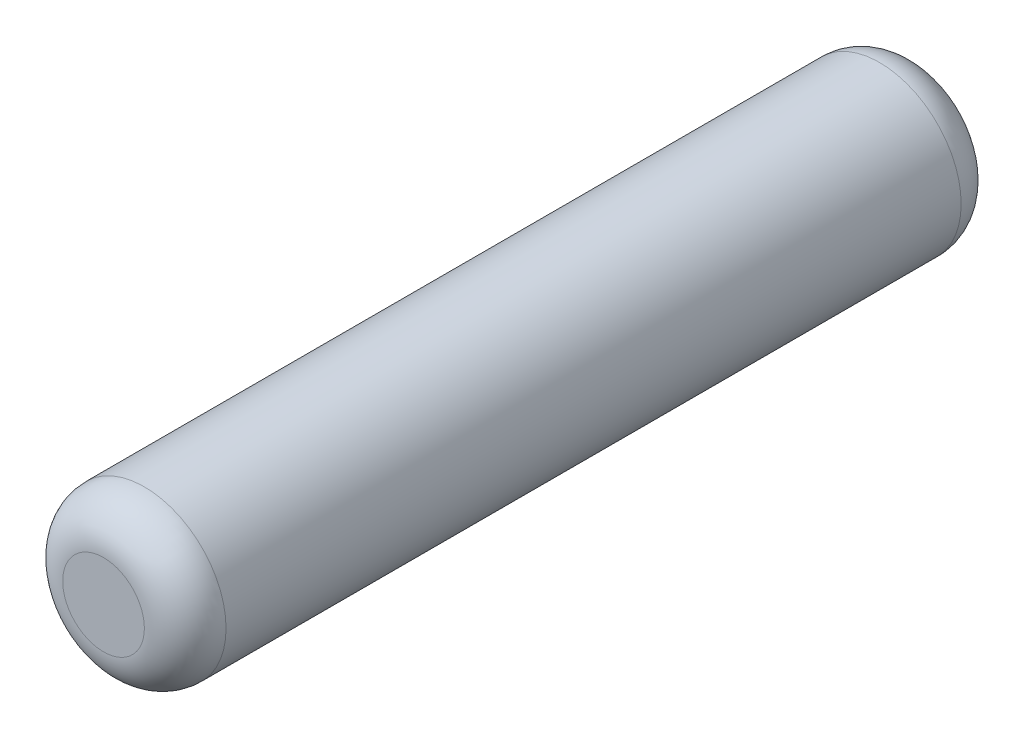
ISO-10303-21;
HEADER;
FILE_DESCRIPTION(('STEP AP214'),'2;1');
FILE_NAME('part.step','',(''),(''),'','','');
FILE_SCHEMA(('AUTOMOTIVE_DESIGN { 1 0 10303 214 1 1 1 1 }'));
ENDSEC;
DATA;
#1=APPLICATION_CONTEXT('core data for automotive mechanical design processes');
#2=APPLICATION_PROTOCOL_DEFINITION('international standard','automotive_design',2000,#1);
#3=PRODUCT_CONTEXT('',#1,'mechanical');
#4=PRODUCT('Part','Part','',(#3));
#5=PRODUCT_RELATED_PRODUCT_CATEGORY('part','',(#4));
#6=PRODUCT_DEFINITION_FORMATION('','',#4);
#7=PRODUCT_DEFINITION_CONTEXT('part definition',#1,'design');
#8=PRODUCT_DEFINITION('design','',#6,#7);
#9=PRODUCT_DEFINITION_SHAPE('','',#8);
#10=(LENGTH_UNIT() NAMED_UNIT(*) SI_UNIT(.MILLI.,.METRE.));
#11=(NAMED_UNIT(*) PLANE_ANGLE_UNIT() SI_UNIT($,.RADIAN.));
#12=(NAMED_UNIT(*) SI_UNIT($,.STERADIAN.) SOLID_ANGLE_UNIT());
#13=UNCERTAINTY_MEASURE_WITH_UNIT(LENGTH_MEASURE(1.E-05),#10,'distance_accuracy_value','');
#14=(GEOMETRIC_REPRESENTATION_CONTEXT(3) GLOBAL_UNCERTAINTY_ASSIGNED_CONTEXT((#13)) GLOBAL_UNIT_ASSIGNED_CONTEXT((#10,
#11,#12)) REPRESENTATION_CONTEXT('',''));
#15=CARTESIAN_POINT('',(0.,0.,0.));
#16=DIRECTION('',(0.,0.,1.));
#17=DIRECTION('',(1.,0.,0.));
#18=AXIS2_PLACEMENT_3D('',#15,#16,#17);
#19=CARTESIAN_POINT('',(0.,0.,20.));
#20=DIRECTION('',(0.,0.,-1.));
#21=DIRECTION('',(-1.,0.,0.));
#22=AXIS2_PLACEMENT_3D('',#19,#20,#21);
#23=CYLINDRICAL_SURFACE('',#22,2.);
#24=CARTESIAN_POINT('',(0.,0.,1.));
#25=DIRECTION('',(0.,0.,1.));
#26=DIRECTION('',(1.,0.,0.));
#27=AXIS2_PLACEMENT_3D('',#24,#25,#26);
#28=CIRCLE('',#27,2.);
#29=CARTESIAN_POINT('',(2.,0.,1.));
#30=VERTEX_POINT('',#29);
#31=EDGE_CURVE('E40',#30,#30,#28,.T.);
#32=ORIENTED_EDGE('',*,*,#31,.T.);
#33=EDGE_LOOP('',(#32));
#34=FACE_BOUND('',#33,.T.);
#35=CARTESIAN_POINT('',(0.,0.,19.));
#36=DIRECTION('',(0.,0.,1.));
#37=DIRECTION('',(1.,0.,0.));
#38=AXIS2_PLACEMENT_3D('',#35,#36,#37);
#39=CIRCLE('',#38,2.);
#40=CARTESIAN_POINT('',(2.,0.,19.));
#41=VERTEX_POINT('',#40);
#42=EDGE_CURVE('E44',#41,#41,#39,.F.);
#43=ORIENTED_EDGE('',*,*,#42,.T.);
#44=EDGE_LOOP('',(#43));
#45=FACE_BOUND('',#44,.T.);
#46=ADVANCED_FACE('F30',(#34,#45),#23,.T.);
#47=CARTESIAN_POINT('',(0.,0.,20.));
#48=DIRECTION('',(0.,0.,1.));
#49=DIRECTION('',(1.,0.,0.));
#50=AXIS2_PLACEMENT_3D('',#47,#48,#49);
#51=PLANE('',#50);
#52=CARTESIAN_POINT('',(0.,0.,20.));
#53=DIRECTION('',(0.,0.,1.));
#54=DIRECTION('',(1.,0.,0.));
#55=AXIS2_PLACEMENT_3D('',#52,#53,#54);
#56=CIRCLE('',#55,1.);
#57=CARTESIAN_POINT('',(1.,0.,20.));
#58=VERTEX_POINT('',#57);
#59=EDGE_CURVE('E10',#58,#58,#56,.T.);
#60=ORIENTED_EDGE('',*,*,#59,.T.);
#61=EDGE_LOOP('',(#60));
#62=FACE_BOUND('',#61,.T.);
#63=ADVANCED_FACE('F62',(#62),#51,.T.);
#64=CARTESIAN_POINT('',(0.,0.,0.));
#65=DIRECTION('',(0.,0.,1.));
#66=DIRECTION('',(1.,0.,0.));
#67=AXIS2_PLACEMENT_3D('',#64,#65,#66);
#68=PLANE('',#67);
#69=CARTESIAN_POINT('',(0.,0.,0.));
#70=DIRECTION('',(0.,0.,1.));
#71=DIRECTION('',(1.,0.,0.));
#72=AXIS2_PLACEMENT_3D('',#69,#70,#71);
#73=CIRCLE('',#72,1.);
#74=CARTESIAN_POINT('',(1.,0.,0.));
#75=VERTEX_POINT('',#74);
#76=EDGE_CURVE('E36',#75,#75,#73,.F.);
#77=ORIENTED_EDGE('',*,*,#76,.T.);
#78=EDGE_LOOP('',(#77));
#79=FACE_BOUND('',#78,.T.);
#80=ADVANCED_FACE('F59',(#79),#68,.F.);
#81=CARTESIAN_POINT('',(0.,0.,1.));
#82=DIRECTION('',(0.,0.,1.));
#83=DIRECTION('',(1.,0.,0.));
#84=AXIS2_PLACEMENT_3D('',#81,#82,#83);
#85=DEGENERATE_TOROIDAL_SURFACE('',#84,1.,1.,.T.);
#86=ORIENTED_EDGE('',*,*,#76,.F.);
#87=EDGE_LOOP('',(#86));
#88=FACE_BOUND('',#87,.T.);
#89=ORIENTED_EDGE('',*,*,#31,.F.);
#90=EDGE_LOOP('',(#89));
#91=FACE_BOUND('',#90,.T.);
#92=ADVANCED_FACE('F54',(#88,#91),#85,.T.);
#93=CARTESIAN_POINT('',(0.,0.,19.));
#94=DIRECTION('',(0.,0.,1.));
#95=DIRECTION('',(1.,0.,0.));
#96=AXIS2_PLACEMENT_3D('',#93,#94,#95);
#97=DEGENERATE_TOROIDAL_SURFACE('',#96,1.,1.,.T.);
#98=ORIENTED_EDGE('',*,*,#42,.F.);
#99=EDGE_LOOP('',(#98));
#100=FACE_BOUND('',#99,.T.);
#101=ORIENTED_EDGE('',*,*,#59,.F.);
#102=EDGE_LOOP('',(#101));
#103=FACE_BOUND('',#102,.T.);
#104=ADVANCED_FACE('F51',(#100,#103),#97,.T.);
#105=CLOSED_SHELL('',(#46,#63,#80,#92,#104));
#106=MANIFOLD_SOLID_BREP('B2',#105);
#107=ADVANCED_BREP_SHAPE_REPRESENTATION('',(#18,#106),#14);
#108=SHAPE_DEFINITION_REPRESENTATION(#9,#107);
ENDSEC;
END-ISO-10303-21;
